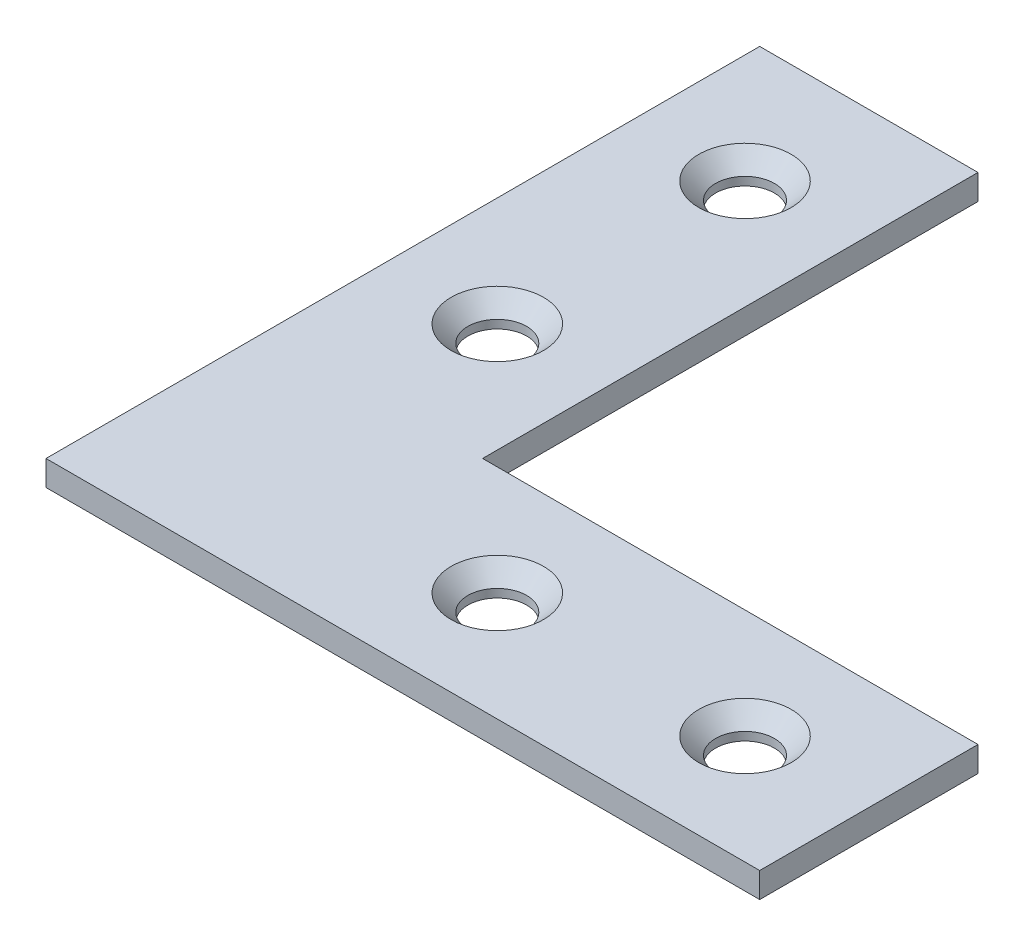
ISO-10303-21;
HEADER;
FILE_DESCRIPTION(('STEP AP214'),'2;1');
FILE_NAME('part.step','',(''),(''),'','','');
FILE_SCHEMA(('AUTOMOTIVE_DESIGN { 1 0 10303 214 1 1 1 1 }'));
ENDSEC;
DATA;
#1=APPLICATION_CONTEXT('core data for automotive mechanical design processes');
#2=APPLICATION_PROTOCOL_DEFINITION('international standard','automotive_design',2000,#1);
#3=PRODUCT_CONTEXT('',#1,'mechanical');
#4=PRODUCT('Part','Part','',(#3));
#5=PRODUCT_RELATED_PRODUCT_CATEGORY('part','',(#4));
#6=PRODUCT_DEFINITION_FORMATION('','',#4);
#7=PRODUCT_DEFINITION_CONTEXT('part definition',#1,'design');
#8=PRODUCT_DEFINITION('design','',#6,#7);
#9=PRODUCT_DEFINITION_SHAPE('','',#8);
#10=(LENGTH_UNIT() NAMED_UNIT(*) SI_UNIT(.MILLI.,.METRE.));
#11=(NAMED_UNIT(*) PLANE_ANGLE_UNIT() SI_UNIT($,.RADIAN.));
#12=(NAMED_UNIT(*) SI_UNIT($,.STERADIAN.) SOLID_ANGLE_UNIT());
#13=UNCERTAINTY_MEASURE_WITH_UNIT(LENGTH_MEASURE(1.E-05),#10,'distance_accuracy_value','');
#14=(GEOMETRIC_REPRESENTATION_CONTEXT(3) GLOBAL_UNCERTAINTY_ASSIGNED_CONTEXT((#13)) GLOBAL_UNIT_ASSIGNED_CONTEXT((#10,
#11,#12)) REPRESENTATION_CONTEXT('',''));
#15=CARTESIAN_POINT('',(0.,0.,0.));
#16=DIRECTION('',(0.,0.,1.));
#17=DIRECTION('',(1.,0.,0.));
#18=AXIS2_PLACEMENT_3D('',#15,#16,#17);
#19=CARTESIAN_POINT('',(0.,1.5,0.));
#20=DIRECTION('',(0.,1.,0.));
#21=DIRECTION('',(0.,0.,1.));
#22=AXIS2_PLACEMENT_3D('',#19,#20,#21);
#23=PLANE('',#22);
#24=CARTESIAN_POINT('',(22.125,1.5,6.50000000000004));
#25=DIRECTION('',(0.,1.,0.));
#26=DIRECTION('',(0.,0.,1.));
#27=AXIS2_PLACEMENT_3D('',#24,#25,#26);
#28=CIRCLE('',#27,2.75000000000001);
#29=CARTESIAN_POINT('',(22.125,1.5,9.25000000000004));
#30=VERTEX_POINT('',#29);
#31=EDGE_CURVE('E179',#30,#30,#28,.F.);
#32=ORIENTED_EDGE('',*,*,#31,.T.);
#33=EDGE_LOOP('',(#32));
#34=FACE_BOUND('',#33,.T.);
#35=CARTESIAN_POINT('',(7.37499999999999,1.5,6.50000000000004));
#36=DIRECTION('',(0.,1.,0.));
#37=DIRECTION('',(0.,0.,1.));
#38=AXIS2_PLACEMENT_3D('',#35,#36,#37);
#39=CIRCLE('',#38,2.75000000000001);
#40=CARTESIAN_POINT('',(7.37499999999999,1.5,9.25000000000005));
#41=VERTEX_POINT('',#40);
#42=EDGE_CURVE('E175',#41,#41,#39,.F.);
#43=ORIENTED_EDGE('',*,*,#42,.T.);
#44=EDGE_LOOP('',(#43));
#45=FACE_BOUND('',#44,.T.);
#46=CARTESIAN_POINT('',(-6.50000000000001,1.5,-7.37499999999997));
#47=DIRECTION('',(0.,1.,0.));
#48=DIRECTION('',(0.,0.,1.));
#49=AXIS2_PLACEMENT_3D('',#46,#47,#48);
#50=CIRCLE('',#49,2.75000000000001);
#51=CARTESIAN_POINT('',(-6.50000000000001,1.5,-4.62499999999996));
#52=VERTEX_POINT('',#51);
#53=EDGE_CURVE('E171',#52,#52,#50,.F.);
#54=ORIENTED_EDGE('',*,*,#53,.T.);
#55=EDGE_LOOP('',(#54));
#56=FACE_BOUND('',#55,.T.);
#57=CARTESIAN_POINT('',(-6.5,1.5,-22.1249999999999));
#58=DIRECTION('',(0.,1.,0.));
#59=DIRECTION('',(0.,0.,1.));
#60=AXIS2_PLACEMENT_3D('',#57,#58,#59);
#61=CIRCLE('',#60,2.75000000000001);
#62=CARTESIAN_POINT('',(-6.5,1.5,-19.3749999999999));
#63=VERTEX_POINT('',#62);
#64=EDGE_CURVE('E167',#63,#63,#61,.F.);
#65=ORIENTED_EDGE('',*,*,#64,.T.);
#66=EDGE_LOOP('',(#65));
#67=FACE_BOUND('',#66,.T.);
#68=DIRECTION('',(0.,0.,-1.));
#69=VECTOR('',#68,1.);
#70=CARTESIAN_POINT('',(0.,1.5,-29.4999999999999));
#71=LINE('',#70,#69);
#72=CARTESIAN_POINT('',(0.,1.5,0.));
#73=VERTEX_POINT('',#72);
#74=CARTESIAN_POINT('',(0.,1.5,-29.4999999999999));
#75=VERTEX_POINT('',#74);
#76=EDGE_CURVE('E149',#73,#75,#71,.T.);
#77=ORIENTED_EDGE('',*,*,#76,.T.);
#78=DIRECTION('',(-1.,0.,0.));
#79=VECTOR('',#78,1.);
#80=CARTESIAN_POINT('',(-13.,1.5,-29.4999999999999));
#81=LINE('',#80,#79);
#82=CARTESIAN_POINT('',(-13.,1.5,-29.4999999999999));
#83=VERTEX_POINT('',#82);
#84=EDGE_CURVE('E98',#75,#83,#81,.T.);
#85=ORIENTED_EDGE('',*,*,#84,.T.);
#86=DIRECTION('',(0.,0.,1.));
#87=VECTOR('',#86,1.);
#88=CARTESIAN_POINT('',(-13.,1.5,13.0000000000001));
#89=LINE('',#88,#87);
#90=CARTESIAN_POINT('',(-13.,1.5,13.0000000000001));
#91=VERTEX_POINT('',#90);
#92=EDGE_CURVE('E110',#83,#91,#89,.T.);
#93=ORIENTED_EDGE('',*,*,#92,.T.);
#94=DIRECTION('',(1.,0.,0.));
#95=VECTOR('',#94,1.);
#96=CARTESIAN_POINT('',(29.5,1.5,13.0000000000001));
#97=LINE('',#96,#95);
#98=CARTESIAN_POINT('',(29.5,1.5,13.0000000000001));
#99=VERTEX_POINT('',#98);
#100=EDGE_CURVE('E105',#91,#99,#97,.T.);
#101=ORIENTED_EDGE('',*,*,#100,.T.);
#102=DIRECTION('',(0.,0.,-1.));
#103=VECTOR('',#102,1.);
#104=CARTESIAN_POINT('',(29.5,1.5,0.));
#105=LINE('',#104,#103);
#106=CARTESIAN_POINT('',(29.5,1.5,0.));
#107=VERTEX_POINT('',#106);
#108=EDGE_CURVE('E108',#99,#107,#105,.T.);
#109=ORIENTED_EDGE('',*,*,#108,.T.);
#110=DIRECTION('',(-1.,0.,0.));
#111=VECTOR('',#110,1.);
#112=CARTESIAN_POINT('',(0.,1.5,0.));
#113=LINE('',#112,#111);
#114=EDGE_CURVE('E60',#107,#73,#113,.T.);
#115=ORIENTED_EDGE('',*,*,#114,.T.);
#116=EDGE_LOOP('',(#77,#85,#93,#101,#109,#115));
#117=FACE_BOUND('',#116,.T.);
#118=ADVANCED_FACE('F41',(#34,#45,#56,#67,#117),#23,.T.);
#119=CARTESIAN_POINT('',(0.,0.,0.));
#120=DIRECTION('',(0.,1.,0.));
#121=DIRECTION('',(0.,0.,1.));
#122=AXIS2_PLACEMENT_3D('',#119,#120,#121);
#123=PLANE('',#122);
#124=DIRECTION('',(0.,0.,-1.));
#125=VECTOR('',#124,1.);
#126=CARTESIAN_POINT('',(0.,0.,-29.4999999999999));
#127=LINE('',#126,#125);
#128=CARTESIAN_POINT('',(0.,0.,0.));
#129=VERTEX_POINT('',#128);
#130=CARTESIAN_POINT('',(0.,0.,-29.4999999999999));
#131=VERTEX_POINT('',#130);
#132=EDGE_CURVE('E132',#129,#131,#127,.T.);
#133=ORIENTED_EDGE('',*,*,#132,.F.);
#134=DIRECTION('',(-1.,0.,0.));
#135=VECTOR('',#134,1.);
#136=CARTESIAN_POINT('',(0.,0.,0.));
#137=LINE('',#136,#135);
#138=CARTESIAN_POINT('',(29.5,0.,0.));
#139=VERTEX_POINT('',#138);
#140=EDGE_CURVE('E89',#139,#129,#137,.T.);
#141=ORIENTED_EDGE('',*,*,#140,.F.);
#142=DIRECTION('',(0.,0.,-1.));
#143=VECTOR('',#142,1.);
#144=CARTESIAN_POINT('',(29.5,0.,0.));
#145=LINE('',#144,#143);
#146=CARTESIAN_POINT('',(29.5,0.,13.0000000000001));
#147=VERTEX_POINT('',#146);
#148=EDGE_CURVE('E83',#147,#139,#145,.T.);
#149=ORIENTED_EDGE('',*,*,#148,.F.);
#150=DIRECTION('',(1.,0.,0.));
#151=VECTOR('',#150,1.);
#152=CARTESIAN_POINT('',(29.5,0.,13.0000000000001));
#153=LINE('',#152,#151);
#154=CARTESIAN_POINT('',(-13.,0.,13.0000000000001));
#155=VERTEX_POINT('',#154);
#156=EDGE_CURVE('E119',#155,#147,#153,.T.);
#157=ORIENTED_EDGE('',*,*,#156,.F.);
#158=DIRECTION('',(0.,0.,1.));
#159=VECTOR('',#158,1.);
#160=CARTESIAN_POINT('',(-13.,0.,13.0000000000001));
#161=LINE('',#160,#159);
#162=CARTESIAN_POINT('',(-13.,0.,-29.4999999999999));
#163=VERTEX_POINT('',#162);
#164=EDGE_CURVE('E140',#163,#155,#161,.T.);
#165=ORIENTED_EDGE('',*,*,#164,.F.);
#166=DIRECTION('',(-1.,0.,0.));
#167=VECTOR('',#166,1.);
#168=CARTESIAN_POINT('',(-13.,0.,-29.4999999999999));
#169=LINE('',#168,#167);
#170=EDGE_CURVE('E136',#131,#163,#169,.T.);
#171=ORIENTED_EDGE('',*,*,#170,.F.);
#172=EDGE_LOOP('',(#133,#141,#149,#157,#165,#171));
#173=FACE_BOUND('',#172,.T.);
#174=CARTESIAN_POINT('',(-6.50000000000001,0.,-7.37499999999997));
#175=DIRECTION('',(0.,1.,0.));
#176=DIRECTION('',(0.,0.,1.));
#177=AXIS2_PLACEMENT_3D('',#174,#175,#176);
#178=CIRCLE('',#177,1.75);
#179=CARTESIAN_POINT('',(-6.50000000000001,0.,-5.62499999999997));
#180=VERTEX_POINT('',#179);
#181=EDGE_CURVE('E137',#180,#180,#178,.T.);
#182=ORIENTED_EDGE('',*,*,#181,.T.);
#183=EDGE_LOOP('',(#182));
#184=FACE_BOUND('',#183,.T.);
#185=CARTESIAN_POINT('',(7.37499999999999,0.,6.50000000000004));
#186=DIRECTION('',(0.,1.,0.));
#187=DIRECTION('',(0.,0.,1.));
#188=AXIS2_PLACEMENT_3D('',#185,#186,#187);
#189=CIRCLE('',#188,1.75);
#190=CARTESIAN_POINT('',(7.37499999999999,0.,8.25000000000004));
#191=VERTEX_POINT('',#190);
#192=EDGE_CURVE('E270',#191,#191,#189,.T.);
#193=ORIENTED_EDGE('',*,*,#192,.T.);
#194=EDGE_LOOP('',(#193));
#195=FACE_BOUND('',#194,.T.);
#196=CARTESIAN_POINT('',(-6.5,0.,-22.1249999999999));
#197=DIRECTION('',(0.,1.,0.));
#198=DIRECTION('',(0.,0.,-1.));
#199=AXIS2_PLACEMENT_3D('',#196,#197,#198);
#200=CIRCLE('',#199,1.75);
#201=CARTESIAN_POINT('',(-6.5,0.,-23.8749999999999));
#202=VERTEX_POINT('',#201);
#203=EDGE_CURVE('E266',#202,#202,#200,.T.);
#204=ORIENTED_EDGE('',*,*,#203,.T.);
#205=EDGE_LOOP('',(#204));
#206=FACE_BOUND('',#205,.T.);
#207=CARTESIAN_POINT('',(22.125,0.,6.50000000000004));
#208=DIRECTION('',(0.,1.,0.));
#209=DIRECTION('',(0.,0.,-1.));
#210=AXIS2_PLACEMENT_3D('',#207,#208,#209);
#211=CIRCLE('',#210,1.75);
#212=CARTESIAN_POINT('',(22.125,0.,4.75000000000004));
#213=VERTEX_POINT('',#212);
#214=EDGE_CURVE('E263',#213,#213,#211,.T.);
#215=ORIENTED_EDGE('',*,*,#214,.T.);
#216=EDGE_LOOP('',(#215));
#217=FACE_BOUND('',#216,.T.);
#218=ADVANCED_FACE('F208',(#173,#184,#195,#206,#217),#123,.F.);
#219=CARTESIAN_POINT('',(0.,1.5,-29.4999999999999));
#220=DIRECTION('',(-1.,0.,0.));
#221=DIRECTION('',(0.,0.,1.));
#222=AXIS2_PLACEMENT_3D('',#219,#220,#221);
#223=PLANE('',#222);
#224=ORIENTED_EDGE('',*,*,#132,.T.);
#225=DIRECTION('',(0.,-1.,0.));
#226=VECTOR('',#225,1.);
#227=CARTESIAN_POINT('',(0.,1.5,-29.4999999999999));
#228=LINE('',#227,#226);
#229=EDGE_CURVE('E160',#75,#131,#228,.T.);
#230=ORIENTED_EDGE('',*,*,#229,.F.);
#231=ORIENTED_EDGE('',*,*,#76,.F.);
#232=DIRECTION('',(0.,-1.,0.));
#233=VECTOR('',#232,1.);
#234=CARTESIAN_POINT('',(0.,1.5,0.));
#235=LINE('',#234,#233);
#236=EDGE_CURVE('E128',#73,#129,#235,.T.);
#237=ORIENTED_EDGE('',*,*,#236,.T.);
#238=EDGE_LOOP('',(#224,#230,#231,#237));
#239=FACE_BOUND('',#238,.T.);
#240=ADVANCED_FACE('F214',(#239),#223,.F.);
#241=CARTESIAN_POINT('',(-13.,1.5,-29.4999999999999));
#242=DIRECTION('',(0.,0.,1.));
#243=DIRECTION('',(1.,0.,0.));
#244=AXIS2_PLACEMENT_3D('',#241,#242,#243);
#245=PLANE('',#244);
#246=ORIENTED_EDGE('',*,*,#170,.T.);
#247=DIRECTION('',(0.,-1.,0.));
#248=VECTOR('',#247,1.);
#249=CARTESIAN_POINT('',(-13.,1.5,-29.4999999999999));
#250=LINE('',#249,#248);
#251=EDGE_CURVE('E156',#83,#163,#250,.T.);
#252=ORIENTED_EDGE('',*,*,#251,.F.);
#253=ORIENTED_EDGE('',*,*,#84,.F.);
#254=ORIENTED_EDGE('',*,*,#229,.T.);
#255=EDGE_LOOP('',(#246,#252,#253,#254));
#256=FACE_BOUND('',#255,.T.);
#257=ADVANCED_FACE('F231',(#256),#245,.F.);
#258=CARTESIAN_POINT('',(-13.,1.5,13.0000000000001));
#259=DIRECTION('',(1.,0.,0.));
#260=DIRECTION('',(0.,0.,-1.));
#261=AXIS2_PLACEMENT_3D('',#258,#259,#260);
#262=PLANE('',#261);
#263=ORIENTED_EDGE('',*,*,#164,.T.);
#264=DIRECTION('',(0.,-1.,0.));
#265=VECTOR('',#264,1.);
#266=CARTESIAN_POINT('',(-13.,1.5,13.0000000000001));
#267=LINE('',#266,#265);
#268=EDGE_CURVE('E121',#91,#155,#267,.T.);
#269=ORIENTED_EDGE('',*,*,#268,.F.);
#270=ORIENTED_EDGE('',*,*,#92,.F.);
#271=ORIENTED_EDGE('',*,*,#251,.T.);
#272=EDGE_LOOP('',(#263,#269,#270,#271));
#273=FACE_BOUND('',#272,.T.);
#274=ADVANCED_FACE('F228',(#273),#262,.F.);
#275=CARTESIAN_POINT('',(29.5,1.5,13.0000000000001));
#276=DIRECTION('',(0.,0.,-1.));
#277=DIRECTION('',(-1.,0.,0.));
#278=AXIS2_PLACEMENT_3D('',#275,#276,#277);
#279=PLANE('',#278);
#280=ORIENTED_EDGE('',*,*,#156,.T.);
#281=DIRECTION('',(0.,-1.,0.));
#282=VECTOR('',#281,1.);
#283=CARTESIAN_POINT('',(29.5,1.5,13.0000000000001));
#284=LINE('',#283,#282);
#285=EDGE_CURVE('E116',#99,#147,#284,.T.);
#286=ORIENTED_EDGE('',*,*,#285,.F.);
#287=ORIENTED_EDGE('',*,*,#100,.F.);
#288=ORIENTED_EDGE('',*,*,#268,.T.);
#289=EDGE_LOOP('',(#280,#286,#287,#288));
#290=FACE_BOUND('',#289,.T.);
#291=ADVANCED_FACE('F117',(#290),#279,.F.);
#292=CARTESIAN_POINT('',(29.5,1.5,0.));
#293=DIRECTION('',(-1.,0.,0.));
#294=DIRECTION('',(0.,0.,1.));
#295=AXIS2_PLACEMENT_3D('',#292,#293,#294);
#296=PLANE('',#295);
#297=ORIENTED_EDGE('',*,*,#148,.T.);
#298=DIRECTION('',(0.,-1.,0.));
#299=VECTOR('',#298,1.);
#300=CARTESIAN_POINT('',(29.5,1.5,0.));
#301=LINE('',#300,#299);
#302=EDGE_CURVE('E122',#107,#139,#301,.T.);
#303=ORIENTED_EDGE('',*,*,#302,.F.);
#304=ORIENTED_EDGE('',*,*,#108,.F.);
#305=ORIENTED_EDGE('',*,*,#285,.T.);
#306=EDGE_LOOP('',(#297,#303,#304,#305));
#307=FACE_BOUND('',#306,.T.);
#308=ADVANCED_FACE('F124',(#307),#296,.F.);
#309=CARTESIAN_POINT('',(0.,1.5,0.));
#310=DIRECTION('',(0.,0.,1.));
#311=DIRECTION('',(1.,0.,0.));
#312=AXIS2_PLACEMENT_3D('',#309,#310,#311);
#313=PLANE('',#312);
#314=ORIENTED_EDGE('',*,*,#140,.T.);
#315=ORIENTED_EDGE('',*,*,#236,.F.);
#316=ORIENTED_EDGE('',*,*,#114,.F.);
#317=ORIENTED_EDGE('',*,*,#302,.T.);
#318=EDGE_LOOP('',(#314,#315,#316,#317));
#319=FACE_BOUND('',#318,.T.);
#320=ADVANCED_FACE('F221',(#319),#313,.F.);
#321=CARTESIAN_POINT('',(-6.50000000000001,1.5,-7.37499999999997));
#322=DIRECTION('',(0.,-1.,0.));
#323=DIRECTION('',(0.,0.,-1.));
#324=AXIS2_PLACEMENT_3D('',#321,#322,#323);
#325=CYLINDRICAL_SURFACE('',#324,1.75);
#326=CARTESIAN_POINT('',(-6.50000000000001,0.499999999999992,-7.37499999999997));
#327=DIRECTION('',(0.,1.,0.));
#328=DIRECTION('',(0.,0.,1.));
#329=AXIS2_PLACEMENT_3D('',#326,#327,#328);
#330=CIRCLE('',#329,1.75);
#331=CARTESIAN_POINT('',(-6.50000000000001,0.499999999999992,-5.62499999999997));
#332=VERTEX_POINT('',#331);
#333=EDGE_CURVE('E52',#332,#332,#330,.T.);
#334=ORIENTED_EDGE('',*,*,#333,.T.);
#335=EDGE_LOOP('',(#334));
#336=FACE_BOUND('',#335,.T.);
#337=ORIENTED_EDGE('',*,*,#181,.F.);
#338=EDGE_LOOP('',(#337));
#339=FACE_BOUND('',#338,.T.);
#340=ADVANCED_FACE('F190',(#336,#339),#325,.F.);
#341=CARTESIAN_POINT('',(7.37499999999999,1.5,6.50000000000004));
#342=DIRECTION('',(0.,-1.,0.));
#343=DIRECTION('',(0.,0.,-1.));
#344=AXIS2_PLACEMENT_3D('',#341,#342,#343);
#345=CYLINDRICAL_SURFACE('',#344,1.75);
#346=CARTESIAN_POINT('',(7.37499999999999,0.499999999999991,6.50000000000004));
#347=DIRECTION('',(0.,1.,0.));
#348=DIRECTION('',(0.,0.,1.));
#349=AXIS2_PLACEMENT_3D('',#346,#347,#348);
#350=CIRCLE('',#349,1.75);
#351=CARTESIAN_POINT('',(7.37499999999999,0.499999999999991,8.25000000000004));
#352=VERTEX_POINT('',#351);
#353=EDGE_CURVE('E183',#352,#352,#350,.T.);
#354=ORIENTED_EDGE('',*,*,#353,.T.);
#355=EDGE_LOOP('',(#354));
#356=FACE_BOUND('',#355,.T.);
#357=ORIENTED_EDGE('',*,*,#192,.F.);
#358=EDGE_LOOP('',(#357));
#359=FACE_BOUND('',#358,.T.);
#360=ADVANCED_FACE('F295',(#356,#359),#345,.F.);
#361=CARTESIAN_POINT('',(-6.5,1.5,-22.1249999999999));
#362=DIRECTION('',(0.,-1.,0.));
#363=DIRECTION('',(0.,0.,-1.));
#364=AXIS2_PLACEMENT_3D('',#361,#362,#363);
#365=CYLINDRICAL_SURFACE('',#364,1.75);
#366=CARTESIAN_POINT('',(-6.5,0.499999999999992,-22.1249999999999));
#367=DIRECTION('',(0.,1.,0.));
#368=DIRECTION('',(0.,0.,1.));
#369=AXIS2_PLACEMENT_3D('',#366,#367,#368);
#370=CIRCLE('',#369,1.75);
#371=CARTESIAN_POINT('',(-6.5,0.499999999999992,-20.3749999999999));
#372=VERTEX_POINT('',#371);
#373=EDGE_CURVE('E11',#372,#372,#370,.T.);
#374=ORIENTED_EDGE('',*,*,#373,.T.);
#375=EDGE_LOOP('',(#374));
#376=FACE_BOUND('',#375,.T.);
#377=ORIENTED_EDGE('',*,*,#203,.F.);
#378=EDGE_LOOP('',(#377));
#379=FACE_BOUND('',#378,.T.);
#380=ADVANCED_FACE('F254',(#376,#379),#365,.F.);
#381=CARTESIAN_POINT('',(22.125,1.5,6.50000000000004));
#382=DIRECTION('',(0.,-1.,0.));
#383=DIRECTION('',(0.,0.,-1.));
#384=AXIS2_PLACEMENT_3D('',#381,#382,#383);
#385=CYLINDRICAL_SURFACE('',#384,1.75);
#386=CARTESIAN_POINT('',(22.125,0.499999999999991,6.50000000000004));
#387=DIRECTION('',(0.,1.,0.));
#388=DIRECTION('',(0.,0.,1.));
#389=AXIS2_PLACEMENT_3D('',#386,#387,#388);
#390=CIRCLE('',#389,1.75);
#391=CARTESIAN_POINT('',(22.125,0.499999999999991,8.25000000000004));
#392=VERTEX_POINT('',#391);
#393=EDGE_CURVE('E163',#392,#392,#390,.T.);
#394=ORIENTED_EDGE('',*,*,#393,.T.);
#395=EDGE_LOOP('',(#394));
#396=FACE_BOUND('',#395,.T.);
#397=ORIENTED_EDGE('',*,*,#214,.F.);
#398=EDGE_LOOP('',(#397));
#399=FACE_BOUND('',#398,.T.);
#400=ADVANCED_FACE('F243',(#396,#399),#385,.F.);
#401=CARTESIAN_POINT('',(22.125,0.499999999999991,6.50000000000004));
#402=DIRECTION('',(0.,1.,0.));
#403=DIRECTION('',(0.,0.,1.));
#404=AXIS2_PLACEMENT_3D('',#401,#402,#403);
#405=CONICAL_SURFACE('',#404,1.75,0.785398163397448);
#406=ORIENTED_EDGE('',*,*,#31,.F.);
#407=EDGE_LOOP('',(#406));
#408=FACE_BOUND('',#407,.T.);
#409=ORIENTED_EDGE('',*,*,#393,.F.);
#410=EDGE_LOOP('',(#409));
#411=FACE_BOUND('',#410,.T.);
#412=ADVANCED_FACE('F202',(#408,#411),#405,.F.);
#413=CARTESIAN_POINT('',(7.37499999999999,0.499999999999991,6.50000000000004));
#414=DIRECTION('',(0.,1.,0.));
#415=DIRECTION('',(0.,0.,1.));
#416=AXIS2_PLACEMENT_3D('',#413,#414,#415);
#417=CONICAL_SURFACE('',#416,1.75,0.785398163397449);
#418=ORIENTED_EDGE('',*,*,#42,.F.);
#419=EDGE_LOOP('',(#418));
#420=FACE_BOUND('',#419,.T.);
#421=ORIENTED_EDGE('',*,*,#353,.F.);
#422=EDGE_LOOP('',(#421));
#423=FACE_BOUND('',#422,.T.);
#424=ADVANCED_FACE('F195',(#420,#423),#417,.F.);
#425=CARTESIAN_POINT('',(-6.50000000000001,0.499999999999992,-7.37499999999997));
#426=DIRECTION('',(0.,1.,0.));
#427=DIRECTION('',(0.,0.,1.));
#428=AXIS2_PLACEMENT_3D('',#425,#426,#427);
#429=CONICAL_SURFACE('',#428,1.75,0.785398163397448);
#430=ORIENTED_EDGE('',*,*,#53,.F.);
#431=EDGE_LOOP('',(#430));
#432=FACE_BOUND('',#431,.T.);
#433=ORIENTED_EDGE('',*,*,#333,.F.);
#434=EDGE_LOOP('',(#433));
#435=FACE_BOUND('',#434,.T.);
#436=ADVANCED_FACE('F193',(#432,#435),#429,.F.);
#437=CARTESIAN_POINT('',(-6.5,0.499999999999992,-22.1249999999999));
#438=DIRECTION('',(0.,1.,0.));
#439=DIRECTION('',(0.,0.,1.));
#440=AXIS2_PLACEMENT_3D('',#437,#438,#439);
#441=CONICAL_SURFACE('',#440,1.75,0.785398163397449);
#442=ORIENTED_EDGE('',*,*,#64,.F.);
#443=EDGE_LOOP('',(#442));
#444=FACE_BOUND('',#443,.T.);
#445=ORIENTED_EDGE('',*,*,#373,.F.);
#446=EDGE_LOOP('',(#445));
#447=FACE_BOUND('',#446,.T.);
#448=ADVANCED_FACE('F44',(#444,#447),#441,.F.);
#449=CLOSED_SHELL('',(#118,#218,#240,#257,#274,#291,#308,#320,#340,#360,#380,#400,#412,#424,
#436,#448));
#450=MANIFOLD_SOLID_BREP('B2',#449);
#451=ADVANCED_BREP_SHAPE_REPRESENTATION('',(#18,#450),#14);
#452=SHAPE_DEFINITION_REPRESENTATION(#9,#451);
ENDSEC;
END-ISO-10303-21;
